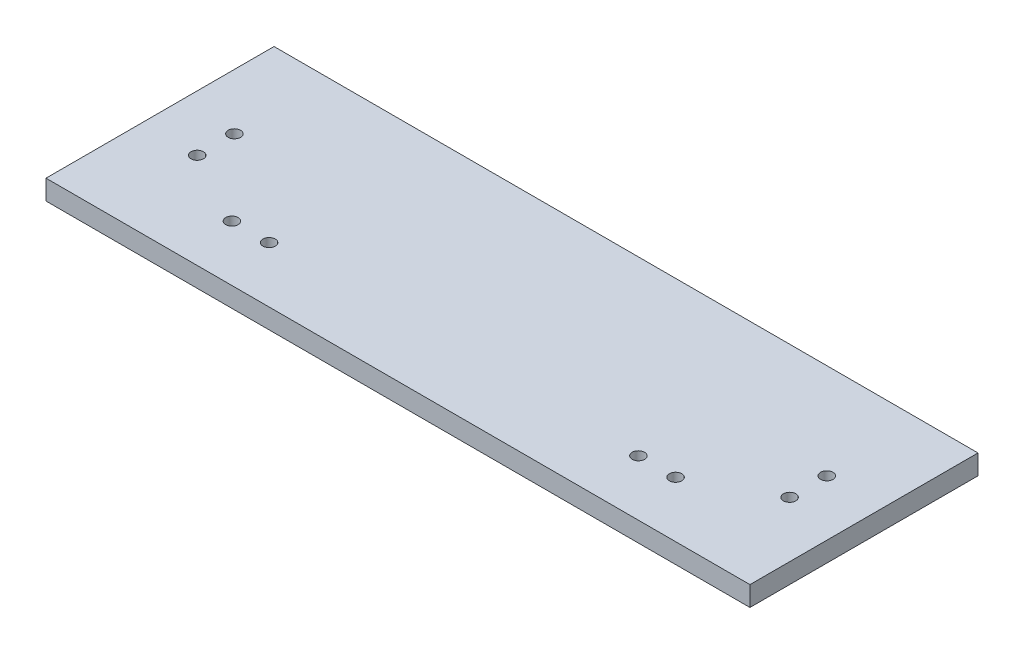
ISO-10303-21;
HEADER;
FILE_DESCRIPTION(('STEP AP214'),'2;1');
FILE_NAME('part.step','',(''),(''),'','','');
FILE_SCHEMA(('AUTOMOTIVE_DESIGN { 1 0 10303 214 1 1 1 1 }'));
ENDSEC;
DATA;
#1=APPLICATION_CONTEXT('core data for automotive mechanical design processes');
#2=APPLICATION_PROTOCOL_DEFINITION('international standard','automotive_design',2000,#1);
#3=PRODUCT_CONTEXT('',#1,'mechanical');
#4=PRODUCT('Part','Part','',(#3));
#5=PRODUCT_RELATED_PRODUCT_CATEGORY('part','',(#4));
#6=PRODUCT_DEFINITION_FORMATION('','',#4);
#7=PRODUCT_DEFINITION_CONTEXT('part definition',#1,'design');
#8=PRODUCT_DEFINITION('design','',#6,#7);
#9=PRODUCT_DEFINITION_SHAPE('','',#8);
#10=(LENGTH_UNIT() NAMED_UNIT(*) SI_UNIT(.MILLI.,.METRE.));
#11=(NAMED_UNIT(*) PLANE_ANGLE_UNIT() SI_UNIT($,.RADIAN.));
#12=(NAMED_UNIT(*) SI_UNIT($,.STERADIAN.) SOLID_ANGLE_UNIT());
#13=UNCERTAINTY_MEASURE_WITH_UNIT(LENGTH_MEASURE(1.E-05),#10,'distance_accuracy_value','');
#14=(GEOMETRIC_REPRESENTATION_CONTEXT(3) GLOBAL_UNCERTAINTY_ASSIGNED_CONTEXT((#13)) GLOBAL_UNIT_ASSIGNED_CONTEXT((#10,
#11,#12)) REPRESENTATION_CONTEXT('',''));
#15=CARTESIAN_POINT('',(0.,0.,0.));
#16=DIRECTION('',(0.,0.,1.));
#17=DIRECTION('',(1.,0.,0.));
#18=AXIS2_PLACEMENT_3D('',#15,#16,#17);
#19=CARTESIAN_POINT('',(-142.,8.,46.));
#20=DIRECTION('',(1.,0.,0.));
#21=DIRECTION('',(0.,0.,-1.));
#22=AXIS2_PLACEMENT_3D('',#19,#20,#21);
#23=PLANE('',#22);
#24=DIRECTION('',(0.,0.,1.));
#25=VECTOR('',#24,1.);
#26=CARTESIAN_POINT('',(-142.,0.,46.));
#27=LINE('',#26,#25);
#28=CARTESIAN_POINT('',(-142.,0.,-46.));
#29=VERTEX_POINT('',#28);
#30=CARTESIAN_POINT('',(-142.,0.,46.));
#31=VERTEX_POINT('',#30);
#32=EDGE_CURVE('E99',#29,#31,#27,.T.);
#33=ORIENTED_EDGE('',*,*,#32,.T.);
#34=DIRECTION('',(0.,-1.,0.));
#35=VECTOR('',#34,1.);
#36=CARTESIAN_POINT('',(-142.,8.,46.));
#37=LINE('',#36,#35);
#38=CARTESIAN_POINT('',(-142.,8.,46.));
#39=VERTEX_POINT('',#38);
#40=EDGE_CURVE('E11',#39,#31,#37,.T.);
#41=ORIENTED_EDGE('',*,*,#40,.F.);
#42=DIRECTION('',(0.,0.,1.));
#43=VECTOR('',#42,1.);
#44=CARTESIAN_POINT('',(-142.,8.,46.));
#45=LINE('',#44,#43);
#46=CARTESIAN_POINT('',(-142.,8.,-46.));
#47=VERTEX_POINT('',#46);
#48=EDGE_CURVE('E86',#47,#39,#45,.T.);
#49=ORIENTED_EDGE('',*,*,#48,.F.);
#50=DIRECTION('',(0.,-1.,0.));
#51=VECTOR('',#50,1.);
#52=CARTESIAN_POINT('',(-142.,8.,-46.));
#53=LINE('',#52,#51);
#54=EDGE_CURVE('E95',#47,#29,#53,.T.);
#55=ORIENTED_EDGE('',*,*,#54,.T.);
#56=EDGE_LOOP('',(#33,#41,#49,#55));
#57=FACE_BOUND('',#56,.T.);
#58=ADVANCED_FACE('F33',(#57),#23,.F.);
#59=CARTESIAN_POINT('',(142.,8.,46.));
#60=DIRECTION('',(0.,0.,-1.));
#61=DIRECTION('',(-1.,0.,0.));
#62=AXIS2_PLACEMENT_3D('',#59,#60,#61);
#63=PLANE('',#62);
#64=DIRECTION('',(1.,0.,0.));
#65=VECTOR('',#64,1.);
#66=CARTESIAN_POINT('',(142.,0.,46.));
#67=LINE('',#66,#65);
#68=CARTESIAN_POINT('',(142.,0.,46.));
#69=VERTEX_POINT('',#68);
#70=EDGE_CURVE('E90',#31,#69,#67,.T.);
#71=ORIENTED_EDGE('',*,*,#70,.T.);
#72=DIRECTION('',(0.,-1.,0.));
#73=VECTOR('',#72,1.);
#74=CARTESIAN_POINT('',(142.,8.,46.));
#75=LINE('',#74,#73);
#76=CARTESIAN_POINT('',(142.,8.,46.));
#77=VERTEX_POINT('',#76);
#78=EDGE_CURVE('E42',#77,#69,#75,.T.);
#79=ORIENTED_EDGE('',*,*,#78,.F.);
#80=DIRECTION('',(1.,0.,0.));
#81=VECTOR('',#80,1.);
#82=CARTESIAN_POINT('',(142.,8.,46.));
#83=LINE('',#82,#81);
#84=EDGE_CURVE('E81',#39,#77,#83,.T.);
#85=ORIENTED_EDGE('',*,*,#84,.F.);
#86=ORIENTED_EDGE('',*,*,#40,.T.);
#87=EDGE_LOOP('',(#71,#79,#85,#86));
#88=FACE_BOUND('',#87,.T.);
#89=ADVANCED_FACE('F89',(#88),#63,.F.);
#90=CARTESIAN_POINT('',(142.,8.,46.));
#91=DIRECTION('',(-1.,0.,0.));
#92=DIRECTION('',(0.,0.,1.));
#93=AXIS2_PLACEMENT_3D('',#90,#91,#92);
#94=PLANE('',#93);
#95=DIRECTION('',(0.,0.,-1.));
#96=VECTOR('',#95,1.);
#97=CARTESIAN_POINT('',(142.,0.,46.));
#98=LINE('',#97,#96);
#99=CARTESIAN_POINT('',(142.,0.,-46.));
#100=VERTEX_POINT('',#99);
#101=EDGE_CURVE('E68',#69,#100,#98,.T.);
#102=ORIENTED_EDGE('',*,*,#101,.T.);
#103=DIRECTION('',(0.,-1.,0.));
#104=VECTOR('',#103,1.);
#105=CARTESIAN_POINT('',(142.,8.,-46.));
#106=LINE('',#105,#104);
#107=CARTESIAN_POINT('',(142.,8.,-46.));
#108=VERTEX_POINT('',#107);
#109=EDGE_CURVE('E91',#108,#100,#106,.T.);
#110=ORIENTED_EDGE('',*,*,#109,.F.);
#111=DIRECTION('',(0.,0.,-1.));
#112=VECTOR('',#111,1.);
#113=CARTESIAN_POINT('',(142.,8.,46.));
#114=LINE('',#113,#112);
#115=EDGE_CURVE('E84',#77,#108,#114,.T.);
#116=ORIENTED_EDGE('',*,*,#115,.F.);
#117=ORIENTED_EDGE('',*,*,#78,.T.);
#118=EDGE_LOOP('',(#102,#110,#116,#117));
#119=FACE_BOUND('',#118,.T.);
#120=ADVANCED_FACE('F93',(#119),#94,.F.);
#121=CARTESIAN_POINT('',(142.,8.,-46.));
#122=DIRECTION('',(0.,0.,1.));
#123=DIRECTION('',(1.,0.,0.));
#124=AXIS2_PLACEMENT_3D('',#121,#122,#123);
#125=PLANE('',#124);
#126=DIRECTION('',(-1.,0.,0.));
#127=VECTOR('',#126,1.);
#128=CARTESIAN_POINT('',(142.,0.,-46.));
#129=LINE('',#128,#127);
#130=EDGE_CURVE('E74',#100,#29,#129,.T.);
#131=ORIENTED_EDGE('',*,*,#130,.T.);
#132=ORIENTED_EDGE('',*,*,#54,.F.);
#133=DIRECTION('',(-1.,0.,0.));
#134=VECTOR('',#133,1.);
#135=CARTESIAN_POINT('',(142.,8.,-46.));
#136=LINE('',#135,#134);
#137=EDGE_CURVE('E51',#108,#47,#136,.T.);
#138=ORIENTED_EDGE('',*,*,#137,.F.);
#139=ORIENTED_EDGE('',*,*,#109,.T.);
#140=EDGE_LOOP('',(#131,#132,#138,#139));
#141=FACE_BOUND('',#140,.T.);
#142=ADVANCED_FACE('F161',(#141),#125,.F.);
#143=CARTESIAN_POINT('',(0.,8.,0.));
#144=DIRECTION('',(0.,1.,0.));
#145=DIRECTION('',(0.,0.,1.));
#146=AXIS2_PLACEMENT_3D('',#143,#144,#145);
#147=PLANE('',#146);
#148=CARTESIAN_POINT('',(-119.5,8.00000000000001,7.49999999999995));
#149=DIRECTION('',(0.,1.,0.));
#150=DIRECTION('',(0.,0.,1.));
#151=AXIS2_PLACEMENT_3D('',#148,#149,#150);
#152=CIRCLE('',#151,2.50000000000001);
#153=CARTESIAN_POINT('',(-119.5,8.00000000000001,9.99999999999996));
#154=VERTEX_POINT('',#153);
#155=EDGE_CURVE('E142',#154,#154,#152,.T.);
#156=ORIENTED_EDGE('',*,*,#155,.F.);
#157=EDGE_LOOP('',(#156));
#158=FACE_BOUND('',#157,.T.);
#159=CARTESIAN_POINT('',(-119.5,8.00000000000001,-7.50000000000005));
#160=DIRECTION('',(0.,1.,0.));
#161=DIRECTION('',(0.,0.,1.));
#162=AXIS2_PLACEMENT_3D('',#159,#160,#161);
#163=CIRCLE('',#162,2.50000000000001);
#164=CARTESIAN_POINT('',(-119.5,8.00000000000001,-5.00000000000004));
#165=VERTEX_POINT('',#164);
#166=EDGE_CURVE('E132',#165,#165,#163,.T.);
#167=ORIENTED_EDGE('',*,*,#166,.F.);
#168=EDGE_LOOP('',(#167));
#169=FACE_BOUND('',#168,.T.);
#170=CARTESIAN_POINT('',(-74.4999999999999,8.00000000000001,23.5));
#171=DIRECTION('',(0.,1.,0.));
#172=DIRECTION('',(0.,0.,1.));
#173=AXIS2_PLACEMENT_3D('',#170,#171,#172);
#174=CIRCLE('',#173,2.49999999999999);
#175=CARTESIAN_POINT('',(-74.4999999999999,8.00000000000001,26.));
#176=VERTEX_POINT('',#175);
#177=EDGE_CURVE('E129',#176,#176,#174,.T.);
#178=ORIENTED_EDGE('',*,*,#177,.F.);
#179=EDGE_LOOP('',(#178));
#180=FACE_BOUND('',#179,.T.);
#181=CARTESIAN_POINT('',(-89.4999999999999,8.00000000000001,23.5));
#182=DIRECTION('',(0.,1.,0.));
#183=DIRECTION('',(0.,0.,1.));
#184=AXIS2_PLACEMENT_3D('',#181,#182,#183);
#185=CIRCLE('',#184,2.5);
#186=CARTESIAN_POINT('',(-89.4999999999999,8.00000000000001,26.));
#187=VERTEX_POINT('',#186);
#188=EDGE_CURVE('E126',#187,#187,#185,.T.);
#189=ORIENTED_EDGE('',*,*,#188,.F.);
#190=EDGE_LOOP('',(#189));
#191=FACE_BOUND('',#190,.T.);
#192=CARTESIAN_POINT('',(119.5,8.00000000000001,7.49999999999995));
#193=DIRECTION('',(0.,1.,0.));
#194=DIRECTION('',(0.,0.,1.));
#195=AXIS2_PLACEMENT_3D('',#192,#193,#194);
#196=CIRCLE('',#195,2.50000000000001);
#197=CARTESIAN_POINT('',(119.5,8.00000000000001,9.99999999999996));
#198=VERTEX_POINT('',#197);
#199=EDGE_CURVE('E122',#198,#198,#196,.T.);
#200=ORIENTED_EDGE('',*,*,#199,.F.);
#201=EDGE_LOOP('',(#200));
#202=FACE_BOUND('',#201,.T.);
#203=CARTESIAN_POINT('',(119.5,8.00000000000001,-7.50000000000005));
#204=DIRECTION('',(0.,1.,0.));
#205=DIRECTION('',(0.,0.,1.));
#206=AXIS2_PLACEMENT_3D('',#203,#204,#205);
#207=CIRCLE('',#206,2.50000000000001);
#208=CARTESIAN_POINT('',(119.5,8.00000000000001,-5.00000000000004));
#209=VERTEX_POINT('',#208);
#210=EDGE_CURVE('E118',#209,#209,#207,.T.);
#211=ORIENTED_EDGE('',*,*,#210,.F.);
#212=EDGE_LOOP('',(#211));
#213=FACE_BOUND('',#212,.T.);
#214=CARTESIAN_POINT('',(89.5,8.00000000000001,23.4999999999999));
#215=DIRECTION('',(0.,1.,0.));
#216=DIRECTION('',(0.,0.,1.));
#217=AXIS2_PLACEMENT_3D('',#214,#215,#216);
#218=CIRCLE('',#217,2.5);
#219=CARTESIAN_POINT('',(89.5,8.00000000000001,25.9999999999999));
#220=VERTEX_POINT('',#219);
#221=EDGE_CURVE('E114',#220,#220,#218,.T.);
#222=ORIENTED_EDGE('',*,*,#221,.F.);
#223=EDGE_LOOP('',(#222));
#224=FACE_BOUND('',#223,.T.);
#225=CARTESIAN_POINT('',(74.5,8.00000000000001,23.4999999999999));
#226=DIRECTION('',(0.,1.,0.));
#227=DIRECTION('',(0.,0.,1.));
#228=AXIS2_PLACEMENT_3D('',#225,#226,#227);
#229=CIRCLE('',#228,2.50000000000001);
#230=CARTESIAN_POINT('',(74.5,8.00000000000001,25.9999999999999));
#231=VERTEX_POINT('',#230);
#232=EDGE_CURVE('E110',#231,#231,#229,.T.);
#233=ORIENTED_EDGE('',*,*,#232,.F.);
#234=EDGE_LOOP('',(#233));
#235=FACE_BOUND('',#234,.T.);
#236=ORIENTED_EDGE('',*,*,#48,.T.);
#237=ORIENTED_EDGE('',*,*,#84,.T.);
#238=ORIENTED_EDGE('',*,*,#115,.T.);
#239=ORIENTED_EDGE('',*,*,#137,.T.);
#240=EDGE_LOOP('',(#236,#237,#238,#239));
#241=FACE_BOUND('',#240,.T.);
#242=ADVANCED_FACE('F82',(#158,#169,#180,#191,#202,#213,#224,#235,#241),#147,.T.);
#243=CARTESIAN_POINT('',(0.,0.,0.));
#244=DIRECTION('',(0.,1.,0.));
#245=DIRECTION('',(0.,0.,1.));
#246=AXIS2_PLACEMENT_3D('',#243,#244,#245);
#247=PLANE('',#246);
#248=CARTESIAN_POINT('',(-119.5,0.,7.49999999999995));
#249=DIRECTION('',(0.,1.,0.));
#250=DIRECTION('',(0.,0.,1.));
#251=AXIS2_PLACEMENT_3D('',#248,#249,#250);
#252=CIRCLE('',#251,2.50000000000001);
#253=CARTESIAN_POINT('',(-119.5,0.,9.99999999999996));
#254=VERTEX_POINT('',#253);
#255=EDGE_CURVE('E36',#254,#254,#252,.T.);
#256=ORIENTED_EDGE('',*,*,#255,.T.);
#257=EDGE_LOOP('',(#256));
#258=FACE_BOUND('',#257,.T.);
#259=CARTESIAN_POINT('',(-119.5,0.,-7.50000000000005));
#260=DIRECTION('',(0.,1.,0.));
#261=DIRECTION('',(0.,0.,1.));
#262=AXIS2_PLACEMENT_3D('',#259,#260,#261);
#263=CIRCLE('',#262,2.50000000000001);
#264=CARTESIAN_POINT('',(-119.5,0.,-5.00000000000004));
#265=VERTEX_POINT('',#264);
#266=EDGE_CURVE('E130',#265,#265,#263,.T.);
#267=ORIENTED_EDGE('',*,*,#266,.T.);
#268=EDGE_LOOP('',(#267));
#269=FACE_BOUND('',#268,.T.);
#270=CARTESIAN_POINT('',(-74.4999999999999,0.,23.5));
#271=DIRECTION('',(0.,1.,0.));
#272=DIRECTION('',(0.,0.,1.));
#273=AXIS2_PLACEMENT_3D('',#270,#271,#272);
#274=CIRCLE('',#273,2.49999999999999);
#275=CARTESIAN_POINT('',(-74.4999999999999,0.,26.));
#276=VERTEX_POINT('',#275);
#277=EDGE_CURVE('E127',#276,#276,#274,.T.);
#278=ORIENTED_EDGE('',*,*,#277,.T.);
#279=EDGE_LOOP('',(#278));
#280=FACE_BOUND('',#279,.T.);
#281=CARTESIAN_POINT('',(-89.4999999999999,0.,23.5));
#282=DIRECTION('',(0.,1.,0.));
#283=DIRECTION('',(0.,0.,1.));
#284=AXIS2_PLACEMENT_3D('',#281,#282,#283);
#285=CIRCLE('',#284,2.5);
#286=CARTESIAN_POINT('',(-89.4999999999999,0.,26.));
#287=VERTEX_POINT('',#286);
#288=EDGE_CURVE('E123',#287,#287,#285,.T.);
#289=ORIENTED_EDGE('',*,*,#288,.T.);
#290=EDGE_LOOP('',(#289));
#291=FACE_BOUND('',#290,.T.);
#292=CARTESIAN_POINT('',(119.5,0.,7.49999999999995));
#293=DIRECTION('',(0.,1.,0.));
#294=DIRECTION('',(0.,0.,1.));
#295=AXIS2_PLACEMENT_3D('',#292,#293,#294);
#296=CIRCLE('',#295,2.50000000000001);
#297=CARTESIAN_POINT('',(119.5,0.,9.99999999999996));
#298=VERTEX_POINT('',#297);
#299=EDGE_CURVE('E119',#298,#298,#296,.T.);
#300=ORIENTED_EDGE('',*,*,#299,.T.);
#301=EDGE_LOOP('',(#300));
#302=FACE_BOUND('',#301,.T.);
#303=CARTESIAN_POINT('',(119.5,0.,-7.50000000000005));
#304=DIRECTION('',(0.,1.,0.));
#305=DIRECTION('',(0.,0.,1.));
#306=AXIS2_PLACEMENT_3D('',#303,#304,#305);
#307=CIRCLE('',#306,2.50000000000001);
#308=CARTESIAN_POINT('',(119.5,0.,-5.00000000000004));
#309=VERTEX_POINT('',#308);
#310=EDGE_CURVE('E115',#309,#309,#307,.T.);
#311=ORIENTED_EDGE('',*,*,#310,.T.);
#312=EDGE_LOOP('',(#311));
#313=FACE_BOUND('',#312,.T.);
#314=CARTESIAN_POINT('',(89.5,0.,23.4999999999999));
#315=DIRECTION('',(0.,1.,0.));
#316=DIRECTION('',(0.,0.,1.));
#317=AXIS2_PLACEMENT_3D('',#314,#315,#316);
#318=CIRCLE('',#317,2.5);
#319=CARTESIAN_POINT('',(89.5,0.,25.9999999999999));
#320=VERTEX_POINT('',#319);
#321=EDGE_CURVE('E111',#320,#320,#318,.T.);
#322=ORIENTED_EDGE('',*,*,#321,.T.);
#323=EDGE_LOOP('',(#322));
#324=FACE_BOUND('',#323,.T.);
#325=CARTESIAN_POINT('',(74.5,0.,23.4999999999999));
#326=DIRECTION('',(0.,1.,0.));
#327=DIRECTION('',(0.,0.,1.));
#328=AXIS2_PLACEMENT_3D('',#325,#326,#327);
#329=CIRCLE('',#328,2.50000000000001);
#330=CARTESIAN_POINT('',(74.5,0.,25.9999999999999));
#331=VERTEX_POINT('',#330);
#332=EDGE_CURVE('E102',#331,#331,#329,.T.);
#333=ORIENTED_EDGE('',*,*,#332,.T.);
#334=EDGE_LOOP('',(#333));
#335=FACE_BOUND('',#334,.T.);
#336=ORIENTED_EDGE('',*,*,#32,.F.);
#337=ORIENTED_EDGE('',*,*,#130,.F.);
#338=ORIENTED_EDGE('',*,*,#101,.F.);
#339=ORIENTED_EDGE('',*,*,#70,.F.);
#340=EDGE_LOOP('',(#336,#337,#338,#339));
#341=FACE_BOUND('',#340,.T.);
#342=ADVANCED_FACE('F160',(#258,#269,#280,#291,#302,#313,#324,#335,#341),#247,.F.);
#343=CARTESIAN_POINT('',(74.5,-1.99999999999999,23.4999999999999));
#344=DIRECTION('',(0.,1.,0.));
#345=DIRECTION('',(0.,0.,1.));
#346=AXIS2_PLACEMENT_3D('',#343,#344,#345);
#347=CYLINDRICAL_SURFACE('',#346,2.50000000000001);
#348=ORIENTED_EDGE('',*,*,#232,.T.);
#349=EDGE_LOOP('',(#348));
#350=FACE_BOUND('',#349,.T.);
#351=ORIENTED_EDGE('',*,*,#332,.F.);
#352=EDGE_LOOP('',(#351));
#353=FACE_BOUND('',#352,.T.);
#354=ADVANCED_FACE('F156',(#350,#353),#347,.F.);
#355=CARTESIAN_POINT('',(89.5,-1.99999999999999,23.4999999999999));
#356=DIRECTION('',(0.,1.,0.));
#357=DIRECTION('',(0.,0.,1.));
#358=AXIS2_PLACEMENT_3D('',#355,#356,#357);
#359=CYLINDRICAL_SURFACE('',#358,2.5);
#360=ORIENTED_EDGE('',*,*,#221,.T.);
#361=EDGE_LOOP('',(#360));
#362=FACE_BOUND('',#361,.T.);
#363=ORIENTED_EDGE('',*,*,#321,.F.);
#364=EDGE_LOOP('',(#363));
#365=FACE_BOUND('',#364,.T.);
#366=ADVANCED_FACE('F201',(#362,#365),#359,.F.);
#367=CARTESIAN_POINT('',(119.5,-1.99999999999999,-7.50000000000005));
#368=DIRECTION('',(0.,1.,0.));
#369=DIRECTION('',(0.,0.,1.));
#370=AXIS2_PLACEMENT_3D('',#367,#368,#369);
#371=CYLINDRICAL_SURFACE('',#370,2.50000000000001);
#372=ORIENTED_EDGE('',*,*,#210,.T.);
#373=EDGE_LOOP('',(#372));
#374=FACE_BOUND('',#373,.T.);
#375=ORIENTED_EDGE('',*,*,#310,.F.);
#376=EDGE_LOOP('',(#375));
#377=FACE_BOUND('',#376,.T.);
#378=ADVANCED_FACE('F210',(#374,#377),#371,.F.);
#379=CARTESIAN_POINT('',(119.5,-1.99999999999999,7.49999999999995));
#380=DIRECTION('',(0.,1.,0.));
#381=DIRECTION('',(0.,0.,1.));
#382=AXIS2_PLACEMENT_3D('',#379,#380,#381);
#383=CYLINDRICAL_SURFACE('',#382,2.50000000000001);
#384=ORIENTED_EDGE('',*,*,#199,.T.);
#385=EDGE_LOOP('',(#384));
#386=FACE_BOUND('',#385,.T.);
#387=ORIENTED_EDGE('',*,*,#299,.F.);
#388=EDGE_LOOP('',(#387));
#389=FACE_BOUND('',#388,.T.);
#390=ADVANCED_FACE('F220',(#386,#389),#383,.F.);
#391=CARTESIAN_POINT('',(-89.4999999999999,-1.99999999999999,23.5));
#392=DIRECTION('',(0.,1.,0.));
#393=DIRECTION('',(0.,0.,1.));
#394=AXIS2_PLACEMENT_3D('',#391,#392,#393);
#395=CYLINDRICAL_SURFACE('',#394,2.5);
#396=ORIENTED_EDGE('',*,*,#188,.T.);
#397=EDGE_LOOP('',(#396));
#398=FACE_BOUND('',#397,.T.);
#399=ORIENTED_EDGE('',*,*,#288,.F.);
#400=EDGE_LOOP('',(#399));
#401=FACE_BOUND('',#400,.T.);
#402=ADVANCED_FACE('F230',(#398,#401),#395,.F.);
#403=CARTESIAN_POINT('',(-74.4999999999999,-1.99999999999999,23.5));
#404=DIRECTION('',(0.,1.,0.));
#405=DIRECTION('',(0.,0.,1.));
#406=AXIS2_PLACEMENT_3D('',#403,#404,#405);
#407=CYLINDRICAL_SURFACE('',#406,2.49999999999999);
#408=ORIENTED_EDGE('',*,*,#177,.T.);
#409=EDGE_LOOP('',(#408));
#410=FACE_BOUND('',#409,.T.);
#411=ORIENTED_EDGE('',*,*,#277,.F.);
#412=EDGE_LOOP('',(#411));
#413=FACE_BOUND('',#412,.T.);
#414=ADVANCED_FACE('F240',(#410,#413),#407,.F.);
#415=CARTESIAN_POINT('',(-119.5,-1.99999999999999,-7.50000000000005));
#416=DIRECTION('',(0.,1.,0.));
#417=DIRECTION('',(0.,0.,1.));
#418=AXIS2_PLACEMENT_3D('',#415,#416,#417);
#419=CYLINDRICAL_SURFACE('',#418,2.50000000000001);
#420=ORIENTED_EDGE('',*,*,#166,.T.);
#421=EDGE_LOOP('',(#420));
#422=FACE_BOUND('',#421,.T.);
#423=ORIENTED_EDGE('',*,*,#266,.F.);
#424=EDGE_LOOP('',(#423));
#425=FACE_BOUND('',#424,.T.);
#426=ADVANCED_FACE('F250',(#422,#425),#419,.F.);
#427=CARTESIAN_POINT('',(-119.5,-1.99999999999999,7.49999999999995));
#428=DIRECTION('',(0.,1.,0.));
#429=DIRECTION('',(0.,0.,1.));
#430=AXIS2_PLACEMENT_3D('',#427,#428,#429);
#431=CYLINDRICAL_SURFACE('',#430,2.50000000000001);
#432=ORIENTED_EDGE('',*,*,#155,.T.);
#433=EDGE_LOOP('',(#432));
#434=FACE_BOUND('',#433,.T.);
#435=ORIENTED_EDGE('',*,*,#255,.F.);
#436=EDGE_LOOP('',(#435));
#437=FACE_BOUND('',#436,.T.);
#438=ADVANCED_FACE('F259',(#434,#437),#431,.F.);
#439=CLOSED_SHELL('',(#58,#89,#120,#142,#242,#342,#354,#366,#378,#390,#402,#414,#426,#438));
#440=MANIFOLD_SOLID_BREP('B2',#439);
#441=ADVANCED_BREP_SHAPE_REPRESENTATION('',(#18,#440),#14);
#442=SHAPE_DEFINITION_REPRESENTATION(#9,#441);
ENDSEC;
END-ISO-10303-21;
